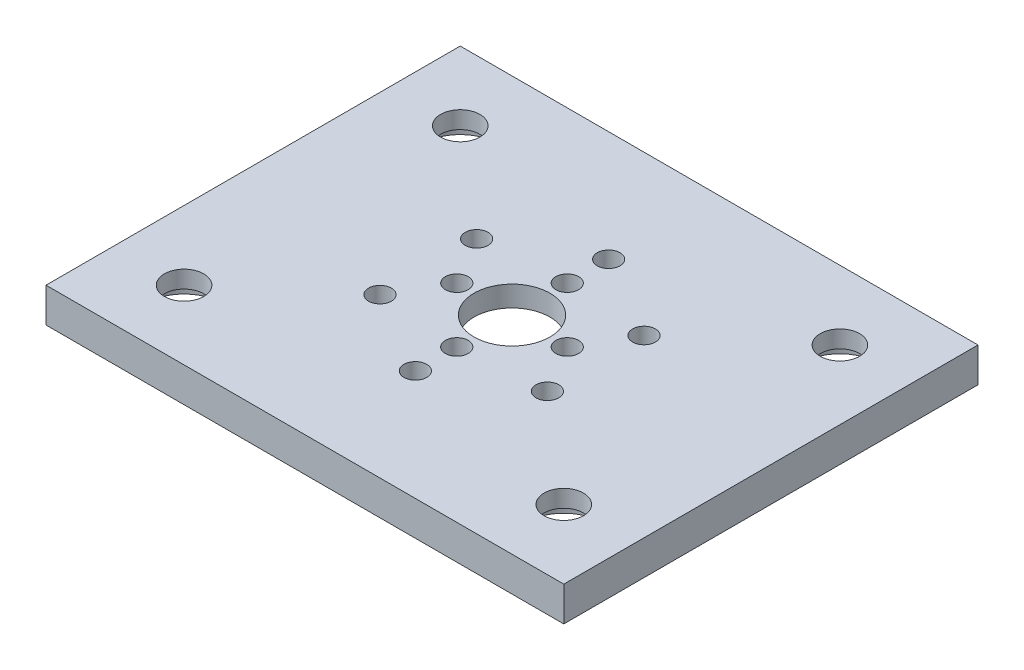
ISO-10303-21;
HEADER;
FILE_DESCRIPTION(('STEP AP214'),'2;1');
FILE_NAME('part.step','',(''),(''),'','','');
FILE_SCHEMA(('AUTOMOTIVE_DESIGN { 1 0 10303 214 1 1 1 1 }'));
ENDSEC;
DATA;
#1=APPLICATION_CONTEXT('core data for automotive mechanical design processes');
#2=APPLICATION_PROTOCOL_DEFINITION('international standard','automotive_design',2000,#1);
#3=PRODUCT_CONTEXT('',#1,'mechanical');
#4=PRODUCT('Part','Part','',(#3));
#5=PRODUCT_RELATED_PRODUCT_CATEGORY('part','',(#4));
#6=PRODUCT_DEFINITION_FORMATION('','',#4);
#7=PRODUCT_DEFINITION_CONTEXT('part definition',#1,'design');
#8=PRODUCT_DEFINITION('design','',#6,#7);
#9=PRODUCT_DEFINITION_SHAPE('','',#8);
#10=(LENGTH_UNIT() NAMED_UNIT(*) SI_UNIT(.MILLI.,.METRE.));
#11=(NAMED_UNIT(*) PLANE_ANGLE_UNIT() SI_UNIT($,.RADIAN.));
#12=(NAMED_UNIT(*) SI_UNIT($,.STERADIAN.) SOLID_ANGLE_UNIT());
#13=UNCERTAINTY_MEASURE_WITH_UNIT(LENGTH_MEASURE(1.E-05),#10,'distance_accuracy_value','');
#14=(GEOMETRIC_REPRESENTATION_CONTEXT(3) GLOBAL_UNCERTAINTY_ASSIGNED_CONTEXT((#13)) GLOBAL_UNIT_ASSIGNED_CONTEXT((#10,
#11,#12)) REPRESENTATION_CONTEXT('',''));
#15=CARTESIAN_POINT('',(0.,0.,0.));
#16=DIRECTION('',(0.,0.,1.));
#17=DIRECTION('',(1.,0.,0.));
#18=AXIS2_PLACEMENT_3D('',#15,#16,#17);
#19=CARTESIAN_POINT('',(0.,5.,0.));
#20=DIRECTION('',(0.,-1.,0.));
#21=DIRECTION('',(0.,0.,-1.));
#22=AXIS2_PLACEMENT_3D('',#19,#20,#21);
#23=PLANE('',#22);
#24=CARTESIAN_POINT('',(49.6243556529822,5.,-23.0000000000001));
#25=DIRECTION('',(0.,1.,0.));
#26=DIRECTION('',(0.,0.,1.));
#27=AXIS2_PLACEMENT_3D('',#24,#25,#26);
#28=CIRCLE('',#27,1.65000000000001);
#29=CARTESIAN_POINT('',(49.6243556529822,5.,-21.3500000000001));
#30=VERTEX_POINT('',#29);
#31=EDGE_CURVE('E162',#30,#30,#28,.T.);
#32=ORIENTED_EDGE('',*,*,#31,.F.);
#33=EDGE_LOOP('',(#32));
#34=FACE_BOUND('',#33,.T.);
#35=CARTESIAN_POINT('',(25.3756443470179,5.,-22.9999999999999));
#36=DIRECTION('',(0.,1.,0.));
#37=DIRECTION('',(0.,0.,1.));
#38=AXIS2_PLACEMENT_3D('',#35,#36,#37);
#39=CIRCLE('',#38,1.65000000000001);
#40=CARTESIAN_POINT('',(25.3756443470179,5.,-21.3499999999999));
#41=VERTEX_POINT('',#40);
#42=EDGE_CURVE('E174',#41,#41,#39,.T.);
#43=ORIENTED_EDGE('',*,*,#42,.F.);
#44=EDGE_LOOP('',(#43));
#45=FACE_BOUND('',#44,.T.);
#46=CARTESIAN_POINT('',(37.5,5.,-30.));
#47=DIRECTION('',(0.,1.,0.));
#48=DIRECTION('',(0.,0.,1.));
#49=AXIS2_PLACEMENT_3D('',#46,#47,#48);
#50=CIRCLE('',#49,5.5);
#51=CARTESIAN_POINT('',(37.5,5.,-24.5));
#52=VERTEX_POINT('',#51);
#53=EDGE_CURVE('E192',#52,#52,#50,.T.);
#54=ORIENTED_EDGE('',*,*,#53,.F.);
#55=EDGE_LOOP('',(#54));
#56=FACE_BOUND('',#55,.T.);
#57=CARTESIAN_POINT('',(65.,5.,-10.));
#58=DIRECTION('',(0.,1.,0.));
#59=DIRECTION('',(0.,0.,1.));
#60=AXIS2_PLACEMENT_3D('',#57,#58,#59);
#61=CIRCLE('',#60,2.85000000000002);
#62=CARTESIAN_POINT('',(65.,5.,-7.14999999999998));
#63=VERTEX_POINT('',#62);
#64=EDGE_CURVE('E201',#63,#63,#61,.T.);
#65=ORIENTED_EDGE('',*,*,#64,.F.);
#66=EDGE_LOOP('',(#65));
#67=FACE_BOUND('',#66,.T.);
#68=CARTESIAN_POINT('',(65.,5.,-50.));
#69=DIRECTION('',(0.,1.,0.));
#70=DIRECTION('',(0.,0.,1.));
#71=AXIS2_PLACEMENT_3D('',#68,#69,#70);
#72=CIRCLE('',#71,2.85000000000002);
#73=CARTESIAN_POINT('',(65.,5.,-47.15));
#74=VERTEX_POINT('',#73);
#75=EDGE_CURVE('E109',#74,#74,#72,.T.);
#76=ORIENTED_EDGE('',*,*,#75,.F.);
#77=EDGE_LOOP('',(#76));
#78=FACE_BOUND('',#77,.T.);
#79=DIRECTION('',(0.,0.,1.));
#80=VECTOR('',#79,1.);
#81=CARTESIAN_POINT('',(0.,5.,0.));
#82=LINE('',#81,#80);
#83=CARTESIAN_POINT('',(0.,5.,-60.));
#84=VERTEX_POINT('',#83);
#85=CARTESIAN_POINT('',(0.,5.,0.));
#86=VERTEX_POINT('',#85);
#87=EDGE_CURVE('E93',#84,#86,#82,.T.);
#88=ORIENTED_EDGE('',*,*,#87,.T.);
#89=DIRECTION('',(1.,0.,0.));
#90=VECTOR('',#89,1.);
#91=CARTESIAN_POINT('',(0.,5.,0.));
#92=LINE('',#91,#90);
#93=CARTESIAN_POINT('',(75.,5.,0.));
#94=VERTEX_POINT('',#93);
#95=EDGE_CURVE('E88',#86,#94,#92,.T.);
#96=ORIENTED_EDGE('',*,*,#95,.T.);
#97=DIRECTION('',(0.,0.,-1.));
#98=VECTOR('',#97,1.);
#99=CARTESIAN_POINT('',(75.,5.,0.));
#100=LINE('',#99,#98);
#101=CARTESIAN_POINT('',(75.,5.,-60.));
#102=VERTEX_POINT('',#101);
#103=EDGE_CURVE('E91',#94,#102,#100,.T.);
#104=ORIENTED_EDGE('',*,*,#103,.T.);
#105=DIRECTION('',(-1.,0.,0.));
#106=VECTOR('',#105,1.);
#107=CARTESIAN_POINT('',(0.,5.,-60.));
#108=LINE('',#107,#106);
#109=EDGE_CURVE('E58',#102,#84,#108,.T.);
#110=ORIENTED_EDGE('',*,*,#109,.T.);
#111=EDGE_LOOP('',(#88,#96,#104,#110));
#112=FACE_BOUND('',#111,.T.);
#113=CARTESIAN_POINT('',(10.,5.,-10.));
#114=DIRECTION('',(0.,1.,0.));
#115=DIRECTION('',(0.,0.,1.));
#116=AXIS2_PLACEMENT_3D('',#113,#114,#115);
#117=CIRCLE('',#116,2.85000000000001);
#118=CARTESIAN_POINT('',(10.,5.,-7.14999999999999));
#119=VERTEX_POINT('',#118);
#120=EDGE_CURVE('E198',#119,#119,#117,.T.);
#121=ORIENTED_EDGE('',*,*,#120,.F.);
#122=EDGE_LOOP('',(#121));
#123=FACE_BOUND('',#122,.T.);
#124=CARTESIAN_POINT('',(10.,5.,-50.));
#125=DIRECTION('',(0.,1.,0.));
#126=DIRECTION('',(0.,0.,1.));
#127=AXIS2_PLACEMENT_3D('',#124,#125,#126);
#128=CIRCLE('',#127,2.85000000000001);
#129=CARTESIAN_POINT('',(10.,5.,-47.15));
#130=VERTEX_POINT('',#129);
#131=EDGE_CURVE('E195',#130,#130,#128,.T.);
#132=ORIENTED_EDGE('',*,*,#131,.F.);
#133=EDGE_LOOP('',(#132));
#134=FACE_BOUND('',#133,.T.);
#135=CARTESIAN_POINT('',(37.5,5.,-44.));
#136=DIRECTION('',(0.,1.,0.));
#137=DIRECTION('',(0.,0.,1.));
#138=AXIS2_PLACEMENT_3D('',#135,#136,#137);
#139=CIRCLE('',#138,1.65000000000001);
#140=CARTESIAN_POINT('',(37.5,5.,-42.35));
#141=VERTEX_POINT('',#140);
#142=EDGE_CURVE('E186',#141,#141,#139,.T.);
#143=ORIENTED_EDGE('',*,*,#142,.F.);
#144=EDGE_LOOP('',(#143));
#145=FACE_BOUND('',#144,.T.);
#146=CARTESIAN_POINT('',(25.3756443470178,5.,-37.));
#147=DIRECTION('',(0.,1.,0.));
#148=DIRECTION('',(0.,0.,1.));
#149=AXIS2_PLACEMENT_3D('',#146,#147,#148);
#150=CIRCLE('',#149,1.65000000000002);
#151=CARTESIAN_POINT('',(25.3756443470178,5.,-35.35));
#152=VERTEX_POINT('',#151);
#153=EDGE_CURVE('E180',#152,#152,#150,.T.);
#154=ORIENTED_EDGE('',*,*,#153,.F.);
#155=EDGE_LOOP('',(#154));
#156=FACE_BOUND('',#155,.T.);
#157=CARTESIAN_POINT('',(37.5,5.,-16.));
#158=DIRECTION('',(0.,1.,0.));
#159=DIRECTION('',(0.,0.,1.));
#160=AXIS2_PLACEMENT_3D('',#157,#158,#159);
#161=CIRCLE('',#160,1.65000000000001);
#162=CARTESIAN_POINT('',(37.5,5.,-14.35));
#163=VERTEX_POINT('',#162);
#164=EDGE_CURVE('E168',#163,#163,#161,.T.);
#165=ORIENTED_EDGE('',*,*,#164,.F.);
#166=EDGE_LOOP('',(#165));
#167=FACE_BOUND('',#166,.T.);
#168=CARTESIAN_POINT('',(49.6243556529821,5.,-37.0000000000001));
#169=DIRECTION('',(0.,1.,0.));
#170=DIRECTION('',(0.,0.,1.));
#171=AXIS2_PLACEMENT_3D('',#168,#169,#170);
#172=CIRCLE('',#171,1.65000000000001);
#173=CARTESIAN_POINT('',(49.6243556529821,5.,-35.3500000000001));
#174=VERTEX_POINT('',#173);
#175=EDGE_CURVE('E118',#174,#174,#172,.T.);
#176=ORIENTED_EDGE('',*,*,#175,.F.);
#177=EDGE_LOOP('',(#176));
#178=FACE_BOUND('',#177,.T.);
#179=CARTESIAN_POINT('',(37.5,5.,-22.));
#180=DIRECTION('',(0.,1.,0.));
#181=DIRECTION('',(0.,0.,1.));
#182=AXIS2_PLACEMENT_3D('',#179,#180,#181);
#183=CIRCLE('',#182,1.65000000000001);
#184=CARTESIAN_POINT('',(37.5,5.,-20.35));
#185=VERTEX_POINT('',#184);
#186=EDGE_CURVE('E143',#185,#185,#183,.T.);
#187=ORIENTED_EDGE('',*,*,#186,.F.);
#188=EDGE_LOOP('',(#187));
#189=FACE_BOUND('',#188,.T.);
#190=CARTESIAN_POINT('',(45.5,5.,-30.));
#191=DIRECTION('',(0.,1.,0.));
#192=DIRECTION('',(0.,0.,1.));
#193=AXIS2_PLACEMENT_3D('',#190,#191,#192);
#194=CIRCLE('',#193,1.65000000000001);
#195=CARTESIAN_POINT('',(45.5,5.,-28.35));
#196=VERTEX_POINT('',#195);
#197=EDGE_CURVE('E501',#196,#196,#194,.T.);
#198=ORIENTED_EDGE('',*,*,#197,.F.);
#199=EDGE_LOOP('',(#198));
#200=FACE_BOUND('',#199,.T.);
#201=CARTESIAN_POINT('',(37.5,5.,-38.));
#202=DIRECTION('',(0.,1.,0.));
#203=DIRECTION('',(0.,0.,1.));
#204=AXIS2_PLACEMENT_3D('',#201,#202,#203);
#205=CIRCLE('',#204,1.65000000000001);
#206=CARTESIAN_POINT('',(37.5,5.,-36.35));
#207=VERTEX_POINT('',#206);
#208=EDGE_CURVE('E492',#207,#207,#205,.T.);
#209=ORIENTED_EDGE('',*,*,#208,.F.);
#210=EDGE_LOOP('',(#209));
#211=FACE_BOUND('',#210,.T.);
#212=CARTESIAN_POINT('',(29.5,5.,-30.));
#213=DIRECTION('',(0.,1.,0.));
#214=DIRECTION('',(0.,0.,1.));
#215=AXIS2_PLACEMENT_3D('',#212,#213,#214);
#216=CIRCLE('',#215,1.65000000000001);
#217=CARTESIAN_POINT('',(29.5,5.,-28.35));
#218=VERTEX_POINT('',#217);
#219=EDGE_CURVE('E488',#218,#218,#216,.T.);
#220=ORIENTED_EDGE('',*,*,#219,.F.);
#221=EDGE_LOOP('',(#220));
#222=FACE_BOUND('',#221,.T.);
#223=ADVANCED_FACE('F39',(#34,#45,#56,#67,#78,#112,#123,#134,#145,#156,#167,#178,#189,#200,#211,
#222),#23,.F.);
#224=CARTESIAN_POINT('',(0.,5.,0.));
#225=DIRECTION('',(1.,0.,0.));
#226=DIRECTION('',(0.,0.,-1.));
#227=AXIS2_PLACEMENT_3D('',#224,#225,#226);
#228=PLANE('',#227);
#229=DIRECTION('',(0.,0.,1.));
#230=VECTOR('',#229,1.);
#231=CARTESIAN_POINT('',(0.,0.,0.));
#232=LINE('',#231,#230);
#233=CARTESIAN_POINT('',(0.,0.,-60.));
#234=VERTEX_POINT('',#233);
#235=CARTESIAN_POINT('',(0.,0.,0.));
#236=VERTEX_POINT('',#235);
#237=EDGE_CURVE('E106',#234,#236,#232,.T.);
#238=ORIENTED_EDGE('',*,*,#237,.T.);
#239=DIRECTION('',(0.,-1.,0.));
#240=VECTOR('',#239,1.);
#241=CARTESIAN_POINT('',(0.,5.,0.));
#242=LINE('',#241,#240);
#243=EDGE_CURVE('E11',#86,#236,#242,.T.);
#244=ORIENTED_EDGE('',*,*,#243,.F.);
#245=ORIENTED_EDGE('',*,*,#87,.F.);
#246=DIRECTION('',(0.,-1.,0.));
#247=VECTOR('',#246,1.);
#248=CARTESIAN_POINT('',(0.,5.,-60.));
#249=LINE('',#248,#247);
#250=EDGE_CURVE('E102',#84,#234,#249,.T.);
#251=ORIENTED_EDGE('',*,*,#250,.T.);
#252=EDGE_LOOP('',(#238,#244,#245,#251));
#253=FACE_BOUND('',#252,.T.);
#254=ADVANCED_FACE('F41',(#253),#228,.F.);
#255=CARTESIAN_POINT('',(0.,5.,0.));
#256=DIRECTION('',(0.,0.,-1.));
#257=DIRECTION('',(-1.,0.,0.));
#258=AXIS2_PLACEMENT_3D('',#255,#256,#257);
#259=PLANE('',#258);
#260=DIRECTION('',(1.,0.,0.));
#261=VECTOR('',#260,1.);
#262=CARTESIAN_POINT('',(0.,0.,0.));
#263=LINE('',#262,#261);
#264=CARTESIAN_POINT('',(75.,0.,0.));
#265=VERTEX_POINT('',#264);
#266=EDGE_CURVE('E97',#236,#265,#263,.T.);
#267=ORIENTED_EDGE('',*,*,#266,.T.);
#268=DIRECTION('',(0.,-1.,0.));
#269=VECTOR('',#268,1.);
#270=CARTESIAN_POINT('',(75.,5.,0.));
#271=LINE('',#270,#269);
#272=EDGE_CURVE('E49',#94,#265,#271,.T.);
#273=ORIENTED_EDGE('',*,*,#272,.F.);
#274=ORIENTED_EDGE('',*,*,#95,.F.);
#275=ORIENTED_EDGE('',*,*,#243,.T.);
#276=EDGE_LOOP('',(#267,#273,#274,#275));
#277=FACE_BOUND('',#276,.T.);
#278=ADVANCED_FACE('F96',(#277),#259,.F.);
#279=CARTESIAN_POINT('',(75.,5.,0.));
#280=DIRECTION('',(-1.,0.,0.));
#281=DIRECTION('',(0.,0.,1.));
#282=AXIS2_PLACEMENT_3D('',#279,#280,#281);
#283=PLANE('',#282);
#284=DIRECTION('',(0.,0.,-1.));
#285=VECTOR('',#284,1.);
#286=CARTESIAN_POINT('',(75.,0.,0.));
#287=LINE('',#286,#285);
#288=CARTESIAN_POINT('',(75.,0.,-60.));
#289=VERTEX_POINT('',#288);
#290=EDGE_CURVE('E75',#265,#289,#287,.T.);
#291=ORIENTED_EDGE('',*,*,#290,.T.);
#292=DIRECTION('',(0.,-1.,0.));
#293=VECTOR('',#292,1.);
#294=CARTESIAN_POINT('',(75.,5.,-60.));
#295=LINE('',#294,#293);
#296=EDGE_CURVE('E98',#102,#289,#295,.T.);
#297=ORIENTED_EDGE('',*,*,#296,.F.);
#298=ORIENTED_EDGE('',*,*,#103,.F.);
#299=ORIENTED_EDGE('',*,*,#272,.T.);
#300=EDGE_LOOP('',(#291,#297,#298,#299));
#301=FACE_BOUND('',#300,.T.);
#302=ADVANCED_FACE('F100',(#301),#283,.F.);
#303=CARTESIAN_POINT('',(0.,5.,-60.));
#304=DIRECTION('',(0.,0.,1.));
#305=DIRECTION('',(1.,0.,0.));
#306=AXIS2_PLACEMENT_3D('',#303,#304,#305);
#307=PLANE('',#306);
#308=DIRECTION('',(-1.,0.,0.));
#309=VECTOR('',#308,1.);
#310=CARTESIAN_POINT('',(0.,0.,-60.));
#311=LINE('',#310,#309);
#312=EDGE_CURVE('E81',#289,#234,#311,.T.);
#313=ORIENTED_EDGE('',*,*,#312,.T.);
#314=ORIENTED_EDGE('',*,*,#250,.F.);
#315=ORIENTED_EDGE('',*,*,#109,.F.);
#316=ORIENTED_EDGE('',*,*,#296,.T.);
#317=EDGE_LOOP('',(#313,#314,#315,#316));
#318=FACE_BOUND('',#317,.T.);
#319=ADVANCED_FACE('F225',(#318),#307,.F.);
#320=CARTESIAN_POINT('',(0.,0.,0.));
#321=DIRECTION('',(0.,-1.,0.));
#322=DIRECTION('',(0.,0.,-1.));
#323=AXIS2_PLACEMENT_3D('',#320,#321,#322);
#324=PLANE('',#323);
#325=CARTESIAN_POINT('',(37.5,0.,-30.));
#326=DIRECTION('',(0.,-1.,0.));
#327=DIRECTION('',(0.,0.,-1.));
#328=AXIS2_PLACEMENT_3D('',#325,#326,#327);
#329=CIRCLE('',#328,11.5);
#330=CARTESIAN_POINT('',(37.5,0.,-41.5));
#331=VERTEX_POINT('',#330);
#332=EDGE_CURVE('E524',#331,#331,#329,.T.);
#333=ORIENTED_EDGE('',*,*,#332,.F.);
#334=EDGE_LOOP('',(#333));
#335=FACE_BOUND('',#334,.T.);
#336=CARTESIAN_POINT('',(10.,0.,-10.));
#337=DIRECTION('',(0.,-1.,0.));
#338=DIRECTION('',(0.,0.,-1.));
#339=AXIS2_PLACEMENT_3D('',#336,#337,#338);
#340=CIRCLE('',#339,5.50000000000001);
#341=CARTESIAN_POINT('',(10.,0.,-15.5));
#342=VERTEX_POINT('',#341);
#343=EDGE_CURVE('E138',#342,#342,#340,.T.);
#344=ORIENTED_EDGE('',*,*,#343,.F.);
#345=EDGE_LOOP('',(#344));
#346=FACE_BOUND('',#345,.T.);
#347=CARTESIAN_POINT('',(10.,0.,-50.));
#348=DIRECTION('',(0.,-1.,0.));
#349=DIRECTION('',(0.,0.,-1.));
#350=AXIS2_PLACEMENT_3D('',#347,#348,#349);
#351=CIRCLE('',#350,5.50000000000001);
#352=CARTESIAN_POINT('',(10.,0.,-55.5));
#353=VERTEX_POINT('',#352);
#354=EDGE_CURVE('E131',#353,#353,#351,.T.);
#355=ORIENTED_EDGE('',*,*,#354,.F.);
#356=EDGE_LOOP('',(#355));
#357=FACE_BOUND('',#356,.T.);
#358=CARTESIAN_POINT('',(65.,0.,-50.));
#359=DIRECTION('',(0.,-1.,0.));
#360=DIRECTION('',(0.,0.,-1.));
#361=AXIS2_PLACEMENT_3D('',#358,#359,#360);
#362=CIRCLE('',#361,5.50000000000002);
#363=CARTESIAN_POINT('',(65.,0.,-55.5));
#364=VERTEX_POINT('',#363);
#365=EDGE_CURVE('E127',#364,#364,#362,.T.);
#366=ORIENTED_EDGE('',*,*,#365,.F.);
#367=EDGE_LOOP('',(#366));
#368=FACE_BOUND('',#367,.T.);
#369=CARTESIAN_POINT('',(65.,0.,-10.));
#370=DIRECTION('',(0.,-1.,0.));
#371=DIRECTION('',(0.,0.,-1.));
#372=AXIS2_PLACEMENT_3D('',#369,#370,#371);
#373=CIRCLE('',#372,5.50000000000002);
#374=CARTESIAN_POINT('',(65.,0.,-15.5));
#375=VERTEX_POINT('',#374);
#376=EDGE_CURVE('E123',#375,#375,#373,.T.);
#377=ORIENTED_EDGE('',*,*,#376,.F.);
#378=EDGE_LOOP('',(#377));
#379=FACE_BOUND('',#378,.T.);
#380=CARTESIAN_POINT('',(49.6243556529821,0.,-37.0000000000001));
#381=DIRECTION('',(0.,-1.,0.));
#382=DIRECTION('',(0.,0.,-1.));
#383=AXIS2_PLACEMENT_3D('',#380,#381,#382);
#384=CIRCLE('',#383,1.65000000000001);
#385=CARTESIAN_POINT('',(49.6243556529821,0.,-38.6500000000001));
#386=VERTEX_POINT('',#385);
#387=EDGE_CURVE('E159',#386,#386,#384,.T.);
#388=ORIENTED_EDGE('',*,*,#387,.F.);
#389=EDGE_LOOP('',(#388));
#390=FACE_BOUND('',#389,.T.);
#391=CARTESIAN_POINT('',(49.6243556529822,0.,-23.0000000000001));
#392=DIRECTION('',(0.,-1.,0.));
#393=DIRECTION('',(0.,0.,-1.));
#394=AXIS2_PLACEMENT_3D('',#391,#392,#393);
#395=CIRCLE('',#394,1.65000000000001);
#396=CARTESIAN_POINT('',(49.6243556529822,0.,-24.6500000000001));
#397=VERTEX_POINT('',#396);
#398=EDGE_CURVE('E165',#397,#397,#395,.T.);
#399=ORIENTED_EDGE('',*,*,#398,.F.);
#400=EDGE_LOOP('',(#399));
#401=FACE_BOUND('',#400,.T.);
#402=CARTESIAN_POINT('',(37.5,0.,-16.));
#403=DIRECTION('',(0.,-1.,0.));
#404=DIRECTION('',(0.,0.,-1.));
#405=AXIS2_PLACEMENT_3D('',#402,#403,#404);
#406=CIRCLE('',#405,1.65000000000001);
#407=CARTESIAN_POINT('',(37.5,0.,-17.65));
#408=VERTEX_POINT('',#407);
#409=EDGE_CURVE('E171',#408,#408,#406,.T.);
#410=ORIENTED_EDGE('',*,*,#409,.F.);
#411=EDGE_LOOP('',(#410));
#412=FACE_BOUND('',#411,.T.);
#413=CARTESIAN_POINT('',(25.3756443470179,0.,-22.9999999999999));
#414=DIRECTION('',(0.,-1.,0.));
#415=DIRECTION('',(0.,0.,-1.));
#416=AXIS2_PLACEMENT_3D('',#413,#414,#415);
#417=CIRCLE('',#416,1.65000000000001);
#418=CARTESIAN_POINT('',(25.3756443470179,0.,-24.65));
#419=VERTEX_POINT('',#418);
#420=EDGE_CURVE('E177',#419,#419,#417,.T.);
#421=ORIENTED_EDGE('',*,*,#420,.F.);
#422=EDGE_LOOP('',(#421));
#423=FACE_BOUND('',#422,.T.);
#424=CARTESIAN_POINT('',(25.3756443470178,0.,-37.));
#425=DIRECTION('',(0.,-1.,0.));
#426=DIRECTION('',(0.,0.,-1.));
#427=AXIS2_PLACEMENT_3D('',#424,#425,#426);
#428=CIRCLE('',#427,1.65000000000001);
#429=CARTESIAN_POINT('',(25.3756443470178,0.,-38.65));
#430=VERTEX_POINT('',#429);
#431=EDGE_CURVE('E183',#430,#430,#428,.T.);
#432=ORIENTED_EDGE('',*,*,#431,.F.);
#433=EDGE_LOOP('',(#432));
#434=FACE_BOUND('',#433,.T.);
#435=CARTESIAN_POINT('',(37.5,0.,-44.));
#436=DIRECTION('',(0.,-1.,0.));
#437=DIRECTION('',(0.,0.,-1.));
#438=AXIS2_PLACEMENT_3D('',#435,#436,#437);
#439=CIRCLE('',#438,1.65000000000001);
#440=CARTESIAN_POINT('',(37.5,0.,-45.65));
#441=VERTEX_POINT('',#440);
#442=EDGE_CURVE('E189',#441,#441,#439,.T.);
#443=ORIENTED_EDGE('',*,*,#442,.F.);
#444=EDGE_LOOP('',(#443));
#445=FACE_BOUND('',#444,.T.);
#446=ORIENTED_EDGE('',*,*,#237,.F.);
#447=ORIENTED_EDGE('',*,*,#312,.F.);
#448=ORIENTED_EDGE('',*,*,#290,.F.);
#449=ORIENTED_EDGE('',*,*,#266,.F.);
#450=EDGE_LOOP('',(#446,#447,#448,#449));
#451=FACE_BOUND('',#450,.T.);
#452=ADVANCED_FACE('F223',(#335,#346,#357,#368,#379,#390,#401,#412,#423,#434,#445,#451),#324,.T.);
#453=CARTESIAN_POINT('',(65.,5.,-50.));
#454=DIRECTION('',(0.,1.,0.));
#455=DIRECTION('',(0.,0.,1.));
#456=AXIS2_PLACEMENT_3D('',#453,#454,#455);
#457=CYLINDRICAL_SURFACE('',#456,2.85000000000002);
#458=CARTESIAN_POINT('',(65.,2.5,-50.));
#459=DIRECTION('',(0.,1.,0.));
#460=DIRECTION('',(0.,0.,1.));
#461=AXIS2_PLACEMENT_3D('',#458,#459,#460);
#462=CIRCLE('',#461,2.85000000000002);
#463=CARTESIAN_POINT('',(65.,2.5,-47.15));
#464=VERTEX_POINT('',#463);
#465=EDGE_CURVE('E120',#464,#464,#462,.F.);
#466=ORIENTED_EDGE('',*,*,#465,.T.);
#467=EDGE_LOOP('',(#466));
#468=FACE_BOUND('',#467,.T.);
#469=ORIENTED_EDGE('',*,*,#75,.T.);
#470=EDGE_LOOP('',(#469));
#471=FACE_BOUND('',#470,.T.);
#472=ADVANCED_FACE('F207',(#468,#471),#457,.F.);
#473=CARTESIAN_POINT('',(65.,5.,-10.));
#474=DIRECTION('',(0.,1.,0.));
#475=DIRECTION('',(0.,0.,1.));
#476=AXIS2_PLACEMENT_3D('',#473,#474,#475);
#477=CYLINDRICAL_SURFACE('',#476,2.85000000000002);
#478=CARTESIAN_POINT('',(65.,2.5,-10.));
#479=DIRECTION('',(0.,1.,0.));
#480=DIRECTION('',(0.,0.,1.));
#481=AXIS2_PLACEMENT_3D('',#478,#479,#480);
#482=CIRCLE('',#481,2.85000000000002);
#483=CARTESIAN_POINT('',(65.,2.5,-7.14999999999998));
#484=VERTEX_POINT('',#483);
#485=EDGE_CURVE('E115',#484,#484,#482,.F.);
#486=ORIENTED_EDGE('',*,*,#485,.T.);
#487=EDGE_LOOP('',(#486));
#488=FACE_BOUND('',#487,.T.);
#489=ORIENTED_EDGE('',*,*,#64,.T.);
#490=EDGE_LOOP('',(#489));
#491=FACE_BOUND('',#490,.T.);
#492=ADVANCED_FACE('F311',(#488,#491),#477,.F.);
#493=CARTESIAN_POINT('',(10.,5.,-10.));
#494=DIRECTION('',(0.,1.,0.));
#495=DIRECTION('',(0.,0.,1.));
#496=AXIS2_PLACEMENT_3D('',#493,#494,#495);
#497=CYLINDRICAL_SURFACE('',#496,2.85000000000001);
#498=CARTESIAN_POINT('',(10.,2.5,-10.));
#499=DIRECTION('',(0.,1.,0.));
#500=DIRECTION('',(0.,0.,1.));
#501=AXIS2_PLACEMENT_3D('',#498,#499,#500);
#502=CIRCLE('',#501,2.85000000000001);
#503=CARTESIAN_POINT('',(10.,2.5,-7.14999999999999));
#504=VERTEX_POINT('',#503);
#505=EDGE_CURVE('E129',#504,#504,#502,.F.);
#506=ORIENTED_EDGE('',*,*,#505,.T.);
#507=EDGE_LOOP('',(#506));
#508=FACE_BOUND('',#507,.T.);
#509=ORIENTED_EDGE('',*,*,#120,.T.);
#510=EDGE_LOOP('',(#509));
#511=FACE_BOUND('',#510,.T.);
#512=ADVANCED_FACE('F319',(#508,#511),#497,.F.);
#513=CARTESIAN_POINT('',(10.,5.,-50.));
#514=DIRECTION('',(0.,1.,0.));
#515=DIRECTION('',(0.,0.,1.));
#516=AXIS2_PLACEMENT_3D('',#513,#514,#515);
#517=CYLINDRICAL_SURFACE('',#516,2.85000000000001);
#518=CARTESIAN_POINT('',(10.,2.5,-50.));
#519=DIRECTION('',(0.,1.,0.));
#520=DIRECTION('',(0.,0.,1.));
#521=AXIS2_PLACEMENT_3D('',#518,#519,#520);
#522=CIRCLE('',#521,2.85000000000001);
#523=CARTESIAN_POINT('',(10.,2.5,-47.15));
#524=VERTEX_POINT('',#523);
#525=EDGE_CURVE('E125',#524,#524,#522,.F.);
#526=ORIENTED_EDGE('',*,*,#525,.T.);
#527=EDGE_LOOP('',(#526));
#528=FACE_BOUND('',#527,.T.);
#529=ORIENTED_EDGE('',*,*,#131,.T.);
#530=EDGE_LOOP('',(#529));
#531=FACE_BOUND('',#530,.T.);
#532=ADVANCED_FACE('F327',(#528,#531),#517,.F.);
#533=CARTESIAN_POINT('',(37.5,-5.,-30.));
#534=DIRECTION('',(0.,1.,0.));
#535=DIRECTION('',(0.,0.,1.));
#536=AXIS2_PLACEMENT_3D('',#533,#534,#535);
#537=CYLINDRICAL_SURFACE('',#536,5.5);
#538=CARTESIAN_POINT('',(37.5,2.,-30.));
#539=DIRECTION('',(0.,1.,0.));
#540=DIRECTION('',(0.,0.,1.));
#541=AXIS2_PLACEMENT_3D('',#538,#539,#540);
#542=CIRCLE('',#541,5.5);
#543=CARTESIAN_POINT('',(37.5,2.,-24.5));
#544=VERTEX_POINT('',#543);
#545=EDGE_CURVE('E481',#544,#544,#542,.F.);
#546=ORIENTED_EDGE('',*,*,#545,.T.);
#547=EDGE_LOOP('',(#546));
#548=FACE_BOUND('',#547,.T.);
#549=ORIENTED_EDGE('',*,*,#53,.T.);
#550=EDGE_LOOP('',(#549));
#551=FACE_BOUND('',#550,.T.);
#552=ADVANCED_FACE('F255',(#548,#551),#537,.F.);
#553=CARTESIAN_POINT('',(37.5,5.,-44.));
#554=DIRECTION('',(0.,1.,0.));
#555=DIRECTION('',(0.,0.,1.));
#556=AXIS2_PLACEMENT_3D('',#553,#554,#555);
#557=CYLINDRICAL_SURFACE('',#556,1.65000000000001);
#558=ORIENTED_EDGE('',*,*,#142,.T.);
#559=EDGE_LOOP('',(#558));
#560=FACE_BOUND('',#559,.T.);
#561=ORIENTED_EDGE('',*,*,#442,.T.);
#562=EDGE_LOOP('',(#561));
#563=FACE_BOUND('',#562,.T.);
#564=ADVANCED_FACE('F250',(#560,#563),#557,.F.);
#565=CARTESIAN_POINT('',(25.3756443470178,5.,-37.));
#566=DIRECTION('',(0.,1.,0.));
#567=DIRECTION('',(0.,0.,1.));
#568=AXIS2_PLACEMENT_3D('',#565,#566,#567);
#569=CYLINDRICAL_SURFACE('',#568,1.65000000000001);
#570=ORIENTED_EDGE('',*,*,#153,.T.);
#571=EDGE_LOOP('',(#570));
#572=FACE_BOUND('',#571,.T.);
#573=ORIENTED_EDGE('',*,*,#431,.T.);
#574=EDGE_LOOP('',(#573));
#575=FACE_BOUND('',#574,.T.);
#576=ADVANCED_FACE('F254',(#572,#575),#569,.F.);
#577=CARTESIAN_POINT('',(25.3756443470179,5.,-22.9999999999999));
#578=DIRECTION('',(0.,1.,0.));
#579=DIRECTION('',(0.,0.,1.));
#580=AXIS2_PLACEMENT_3D('',#577,#578,#579);
#581=CYLINDRICAL_SURFACE('',#580,1.65000000000001);
#582=ORIENTED_EDGE('',*,*,#42,.T.);
#583=EDGE_LOOP('',(#582));
#584=FACE_BOUND('',#583,.T.);
#585=ORIENTED_EDGE('',*,*,#420,.T.);
#586=EDGE_LOOP('',(#585));
#587=FACE_BOUND('',#586,.T.);
#588=ADVANCED_FACE('F265',(#584,#587),#581,.F.);
#589=CARTESIAN_POINT('',(37.5,5.,-16.));
#590=DIRECTION('',(0.,1.,0.));
#591=DIRECTION('',(0.,0.,1.));
#592=AXIS2_PLACEMENT_3D('',#589,#590,#591);
#593=CYLINDRICAL_SURFACE('',#592,1.65000000000001);
#594=ORIENTED_EDGE('',*,*,#164,.T.);
#595=EDGE_LOOP('',(#594));
#596=FACE_BOUND('',#595,.T.);
#597=ORIENTED_EDGE('',*,*,#409,.T.);
#598=EDGE_LOOP('',(#597));
#599=FACE_BOUND('',#598,.T.);
#600=ADVANCED_FACE('F274',(#596,#599),#593,.F.);
#601=CARTESIAN_POINT('',(49.6243556529822,5.,-23.0000000000001));
#602=DIRECTION('',(0.,1.,0.));
#603=DIRECTION('',(0.,0.,1.));
#604=AXIS2_PLACEMENT_3D('',#601,#602,#603);
#605=CYLINDRICAL_SURFACE('',#604,1.65000000000001);
#606=ORIENTED_EDGE('',*,*,#31,.T.);
#607=EDGE_LOOP('',(#606));
#608=FACE_BOUND('',#607,.T.);
#609=ORIENTED_EDGE('',*,*,#398,.T.);
#610=EDGE_LOOP('',(#609));
#611=FACE_BOUND('',#610,.T.);
#612=ADVANCED_FACE('F283',(#608,#611),#605,.F.);
#613=CARTESIAN_POINT('',(49.6243556529821,5.,-37.0000000000001));
#614=DIRECTION('',(0.,1.,0.));
#615=DIRECTION('',(0.,0.,1.));
#616=AXIS2_PLACEMENT_3D('',#613,#614,#615);
#617=CYLINDRICAL_SURFACE('',#616,1.65000000000001);
#618=ORIENTED_EDGE('',*,*,#175,.T.);
#619=EDGE_LOOP('',(#618));
#620=FACE_BOUND('',#619,.T.);
#621=ORIENTED_EDGE('',*,*,#387,.T.);
#622=EDGE_LOOP('',(#621));
#623=FACE_BOUND('',#622,.T.);
#624=ADVANCED_FACE('F292',(#620,#623),#617,.F.);
#625=CARTESIAN_POINT('',(65.,2.5,-10.));
#626=DIRECTION('',(0.,1.,0.));
#627=DIRECTION('',(0.,0.,1.));
#628=AXIS2_PLACEMENT_3D('',#625,#626,#627);
#629=PLANE('',#628);
#630=CARTESIAN_POINT('',(65.,2.5,-10.));
#631=DIRECTION('',(0.,-1.,0.));
#632=DIRECTION('',(0.,0.,-1.));
#633=AXIS2_PLACEMENT_3D('',#630,#631,#632);
#634=CIRCLE('',#633,5.50000000000002);
#635=CARTESIAN_POINT('',(65.,2.5,-15.5));
#636=VERTEX_POINT('',#635);
#637=EDGE_CURVE('E119',#636,#636,#634,.T.);
#638=ORIENTED_EDGE('',*,*,#637,.T.);
#639=EDGE_LOOP('',(#638));
#640=FACE_BOUND('',#639,.T.);
#641=ORIENTED_EDGE('',*,*,#485,.F.);
#642=EDGE_LOOP('',(#641));
#643=FACE_BOUND('',#642,.T.);
#644=ADVANCED_FACE('F301',(#640,#643),#629,.F.);
#645=CARTESIAN_POINT('',(65.,0.,-10.));
#646=DIRECTION('',(0.,-1.,0.));
#647=DIRECTION('',(0.,0.,-1.));
#648=AXIS2_PLACEMENT_3D('',#645,#646,#647);
#649=CYLINDRICAL_SURFACE('',#648,5.50000000000002);
#650=ORIENTED_EDGE('',*,*,#637,.F.);
#651=EDGE_LOOP('',(#650));
#652=FACE_BOUND('',#651,.T.);
#653=ORIENTED_EDGE('',*,*,#376,.T.);
#654=EDGE_LOOP('',(#653));
#655=FACE_BOUND('',#654,.T.);
#656=ADVANCED_FACE('F342',(#652,#655),#649,.F.);
#657=CARTESIAN_POINT('',(65.,2.5,-50.));
#658=DIRECTION('',(0.,1.,0.));
#659=DIRECTION('',(0.,0.,1.));
#660=AXIS2_PLACEMENT_3D('',#657,#658,#659);
#661=PLANE('',#660);
#662=CARTESIAN_POINT('',(65.,2.5,-50.));
#663=DIRECTION('',(0.,-1.,0.));
#664=DIRECTION('',(0.,0.,-1.));
#665=AXIS2_PLACEMENT_3D('',#662,#663,#664);
#666=CIRCLE('',#665,5.50000000000002);
#667=CARTESIAN_POINT('',(65.,2.5,-55.5));
#668=VERTEX_POINT('',#667);
#669=EDGE_CURVE('E124',#668,#668,#666,.T.);
#670=ORIENTED_EDGE('',*,*,#669,.T.);
#671=EDGE_LOOP('',(#670));
#672=FACE_BOUND('',#671,.T.);
#673=ORIENTED_EDGE('',*,*,#465,.F.);
#674=EDGE_LOOP('',(#673));
#675=FACE_BOUND('',#674,.T.);
#676=ADVANCED_FACE('F351',(#672,#675),#661,.F.);
#677=CARTESIAN_POINT('',(65.,0.,-50.));
#678=DIRECTION('',(0.,-1.,0.));
#679=DIRECTION('',(0.,0.,-1.));
#680=AXIS2_PLACEMENT_3D('',#677,#678,#679);
#681=CYLINDRICAL_SURFACE('',#680,5.50000000000002);
#682=ORIENTED_EDGE('',*,*,#669,.F.);
#683=EDGE_LOOP('',(#682));
#684=FACE_BOUND('',#683,.T.);
#685=ORIENTED_EDGE('',*,*,#365,.T.);
#686=EDGE_LOOP('',(#685));
#687=FACE_BOUND('',#686,.T.);
#688=ADVANCED_FACE('F360',(#684,#687),#681,.F.);
#689=CARTESIAN_POINT('',(10.,2.5,-50.));
#690=DIRECTION('',(0.,1.,0.));
#691=DIRECTION('',(0.,0.,1.));
#692=AXIS2_PLACEMENT_3D('',#689,#690,#691);
#693=PLANE('',#692);
#694=CARTESIAN_POINT('',(10.,2.5,-50.));
#695=DIRECTION('',(0.,-1.,0.));
#696=DIRECTION('',(0.,0.,-1.));
#697=AXIS2_PLACEMENT_3D('',#694,#695,#696);
#698=CIRCLE('',#697,5.50000000000001);
#699=CARTESIAN_POINT('',(10.,2.5,-55.5));
#700=VERTEX_POINT('',#699);
#701=EDGE_CURVE('E128',#700,#700,#698,.T.);
#702=ORIENTED_EDGE('',*,*,#701,.T.);
#703=EDGE_LOOP('',(#702));
#704=FACE_BOUND('',#703,.T.);
#705=ORIENTED_EDGE('',*,*,#525,.F.);
#706=EDGE_LOOP('',(#705));
#707=FACE_BOUND('',#706,.T.);
#708=ADVANCED_FACE('F369',(#704,#707),#693,.F.);
#709=CARTESIAN_POINT('',(10.,0.,-50.));
#710=DIRECTION('',(0.,-1.,0.));
#711=DIRECTION('',(0.,0.,-1.));
#712=AXIS2_PLACEMENT_3D('',#709,#710,#711);
#713=CYLINDRICAL_SURFACE('',#712,5.50000000000001);
#714=ORIENTED_EDGE('',*,*,#701,.F.);
#715=EDGE_LOOP('',(#714));
#716=FACE_BOUND('',#715,.T.);
#717=ORIENTED_EDGE('',*,*,#354,.T.);
#718=EDGE_LOOP('',(#717));
#719=FACE_BOUND('',#718,.T.);
#720=ADVANCED_FACE('F378',(#716,#719),#713,.F.);
#721=CARTESIAN_POINT('',(10.,2.5,-10.));
#722=DIRECTION('',(0.,1.,0.));
#723=DIRECTION('',(0.,0.,1.));
#724=AXIS2_PLACEMENT_3D('',#721,#722,#723);
#725=PLANE('',#724);
#726=CARTESIAN_POINT('',(10.,2.5,-10.));
#727=DIRECTION('',(0.,-1.,0.));
#728=DIRECTION('',(0.,0.,-1.));
#729=AXIS2_PLACEMENT_3D('',#726,#727,#728);
#730=CIRCLE('',#729,5.50000000000001);
#731=CARTESIAN_POINT('',(10.,2.5,-15.5));
#732=VERTEX_POINT('',#731);
#733=EDGE_CURVE('E132',#732,#732,#730,.T.);
#734=ORIENTED_EDGE('',*,*,#733,.T.);
#735=EDGE_LOOP('',(#734));
#736=FACE_BOUND('',#735,.T.);
#737=ORIENTED_EDGE('',*,*,#505,.F.);
#738=EDGE_LOOP('',(#737));
#739=FACE_BOUND('',#738,.T.);
#740=ADVANCED_FACE('F387',(#736,#739),#725,.F.);
#741=CARTESIAN_POINT('',(10.,0.,-10.));
#742=DIRECTION('',(0.,-1.,0.));
#743=DIRECTION('',(0.,0.,-1.));
#744=AXIS2_PLACEMENT_3D('',#741,#742,#743);
#745=CYLINDRICAL_SURFACE('',#744,5.50000000000001);
#746=ORIENTED_EDGE('',*,*,#733,.F.);
#747=EDGE_LOOP('',(#746));
#748=FACE_BOUND('',#747,.T.);
#749=ORIENTED_EDGE('',*,*,#343,.T.);
#750=EDGE_LOOP('',(#749));
#751=FACE_BOUND('',#750,.T.);
#752=ADVANCED_FACE('F395',(#748,#751),#745,.F.);
#753=CARTESIAN_POINT('',(37.5,5.,-22.));
#754=DIRECTION('',(0.,1.,0.));
#755=DIRECTION('',(0.,0.,1.));
#756=AXIS2_PLACEMENT_3D('',#753,#754,#755);
#757=CYLINDRICAL_SURFACE('',#756,1.65000000000001);
#758=CARTESIAN_POINT('',(37.5,2.,-22.));
#759=DIRECTION('',(0.,1.,0.));
#760=DIRECTION('',(0.,0.,1.));
#761=AXIS2_PLACEMENT_3D('',#758,#759,#760);
#762=CIRCLE('',#761,1.65000000000001);
#763=CARTESIAN_POINT('',(37.5,2.,-20.35));
#764=VERTEX_POINT('',#763);
#765=EDGE_CURVE('E489',#764,#764,#762,.F.);
#766=ORIENTED_EDGE('',*,*,#765,.T.);
#767=EDGE_LOOP('',(#766));
#768=FACE_BOUND('',#767,.T.);
#769=ORIENTED_EDGE('',*,*,#186,.T.);
#770=EDGE_LOOP('',(#769));
#771=FACE_BOUND('',#770,.T.);
#772=ADVANCED_FACE('F402',(#768,#771),#757,.F.);
#773=CARTESIAN_POINT('',(45.5,5.,-30.));
#774=DIRECTION('',(0.,1.,0.));
#775=DIRECTION('',(0.,0.,1.));
#776=AXIS2_PLACEMENT_3D('',#773,#774,#775);
#777=CYLINDRICAL_SURFACE('',#776,1.65000000000001);
#778=CARTESIAN_POINT('',(45.5,2.,-30.));
#779=DIRECTION('',(0.,1.,0.));
#780=DIRECTION('',(0.,0.,1.));
#781=AXIS2_PLACEMENT_3D('',#778,#779,#780);
#782=CIRCLE('',#781,1.65000000000001);
#783=CARTESIAN_POINT('',(45.5,2.,-28.35));
#784=VERTEX_POINT('',#783);
#785=EDGE_CURVE('E518',#784,#784,#782,.F.);
#786=ORIENTED_EDGE('',*,*,#785,.T.);
#787=EDGE_LOOP('',(#786));
#788=FACE_BOUND('',#787,.T.);
#789=ORIENTED_EDGE('',*,*,#197,.T.);
#790=EDGE_LOOP('',(#789));
#791=FACE_BOUND('',#790,.T.);
#792=ADVANCED_FACE('F419',(#788,#791),#777,.F.);
#793=CARTESIAN_POINT('',(37.5,5.,-38.));
#794=DIRECTION('',(0.,1.,0.));
#795=DIRECTION('',(0.,0.,1.));
#796=AXIS2_PLACEMENT_3D('',#793,#794,#795);
#797=CYLINDRICAL_SURFACE('',#796,1.65000000000001);
#798=CARTESIAN_POINT('',(37.5,2.,-38.));
#799=DIRECTION('',(0.,1.,0.));
#800=DIRECTION('',(0.,0.,1.));
#801=AXIS2_PLACEMENT_3D('',#798,#799,#800);
#802=CIRCLE('',#801,1.65000000000001);
#803=CARTESIAN_POINT('',(37.5,2.,-36.35));
#804=VERTEX_POINT('',#803);
#805=EDGE_CURVE('E495',#804,#804,#802,.F.);
#806=ORIENTED_EDGE('',*,*,#805,.T.);
#807=EDGE_LOOP('',(#806));
#808=FACE_BOUND('',#807,.T.);
#809=ORIENTED_EDGE('',*,*,#208,.T.);
#810=EDGE_LOOP('',(#809));
#811=FACE_BOUND('',#810,.T.);
#812=ADVANCED_FACE('F430',(#808,#811),#797,.F.);
#813=CARTESIAN_POINT('',(29.5,5.,-30.));
#814=DIRECTION('',(0.,1.,0.));
#815=DIRECTION('',(0.,0.,1.));
#816=AXIS2_PLACEMENT_3D('',#813,#814,#815);
#817=CYLINDRICAL_SURFACE('',#816,1.65000000000001);
#818=CARTESIAN_POINT('',(29.5,2.,-30.));
#819=DIRECTION('',(0.,1.,0.));
#820=DIRECTION('',(0.,0.,1.));
#821=AXIS2_PLACEMENT_3D('',#818,#819,#820);
#822=CIRCLE('',#821,1.65000000000001);
#823=CARTESIAN_POINT('',(29.5,2.,-28.35));
#824=VERTEX_POINT('',#823);
#825=EDGE_CURVE('E43',#824,#824,#822,.F.);
#826=ORIENTED_EDGE('',*,*,#825,.T.);
#827=EDGE_LOOP('',(#826));
#828=FACE_BOUND('',#827,.T.);
#829=ORIENTED_EDGE('',*,*,#219,.T.);
#830=EDGE_LOOP('',(#829));
#831=FACE_BOUND('',#830,.T.);
#832=ADVANCED_FACE('F440',(#828,#831),#817,.F.);
#833=CARTESIAN_POINT('',(37.5,2.,-30.));
#834=DIRECTION('',(0.,1.,0.));
#835=DIRECTION('',(0.,0.,1.));
#836=AXIS2_PLACEMENT_3D('',#833,#834,#835);
#837=PLANE('',#836);
#838=ORIENTED_EDGE('',*,*,#765,.F.);
#839=EDGE_LOOP('',(#838));
#840=FACE_BOUND('',#839,.T.);
#841=ORIENTED_EDGE('',*,*,#785,.F.);
#842=EDGE_LOOP('',(#841));
#843=FACE_BOUND('',#842,.T.);
#844=CARTESIAN_POINT('',(37.5,2.,-30.));
#845=DIRECTION('',(0.,-1.,0.));
#846=DIRECTION('',(0.,0.,-1.));
#847=AXIS2_PLACEMENT_3D('',#844,#845,#846);
#848=CIRCLE('',#847,11.5);
#849=CARTESIAN_POINT('',(37.5,2.,-41.5));
#850=VERTEX_POINT('',#849);
#851=EDGE_CURVE('E521',#850,#850,#848,.T.);
#852=ORIENTED_EDGE('',*,*,#851,.T.);
#853=EDGE_LOOP('',(#852));
#854=FACE_BOUND('',#853,.T.);
#855=ORIENTED_EDGE('',*,*,#825,.F.);
#856=EDGE_LOOP('',(#855));
#857=FACE_BOUND('',#856,.T.);
#858=ORIENTED_EDGE('',*,*,#805,.F.);
#859=EDGE_LOOP('',(#858));
#860=FACE_BOUND('',#859,.T.);
#861=ORIENTED_EDGE('',*,*,#545,.F.);
#862=EDGE_LOOP('',(#861));
#863=FACE_BOUND('',#862,.T.);
#864=ADVANCED_FACE('F450',(#840,#843,#854,#857,#860,#863),#837,.F.);
#865=CARTESIAN_POINT('',(37.5,0.,-30.));
#866=DIRECTION('',(0.,-1.,0.));
#867=DIRECTION('',(0.,0.,-1.));
#868=AXIS2_PLACEMENT_3D('',#865,#866,#867);
#869=CYLINDRICAL_SURFACE('',#868,11.5);
#870=ORIENTED_EDGE('',*,*,#851,.F.);
#871=EDGE_LOOP('',(#870));
#872=FACE_BOUND('',#871,.T.);
#873=ORIENTED_EDGE('',*,*,#332,.T.);
#874=EDGE_LOOP('',(#873));
#875=FACE_BOUND('',#874,.T.);
#876=ADVANCED_FACE('F460',(#872,#875),#869,.F.);
#877=CLOSED_SHELL('',(#223,#254,#278,#302,#319,#452,#472,#492,#512,#532,#552,#564,#576,#588,
#600,#612,#624,#644,#656,#676,#688,#708,#720,#740,#752,#772,#792,#812,#832,#864,#876));
#878=MANIFOLD_SOLID_BREP('B2',#877);
#879=ADVANCED_BREP_SHAPE_REPRESENTATION('',(#18,#878),#14);
#880=SHAPE_DEFINITION_REPRESENTATION(#9,#879);
ENDSEC;
END-ISO-10303-21;
